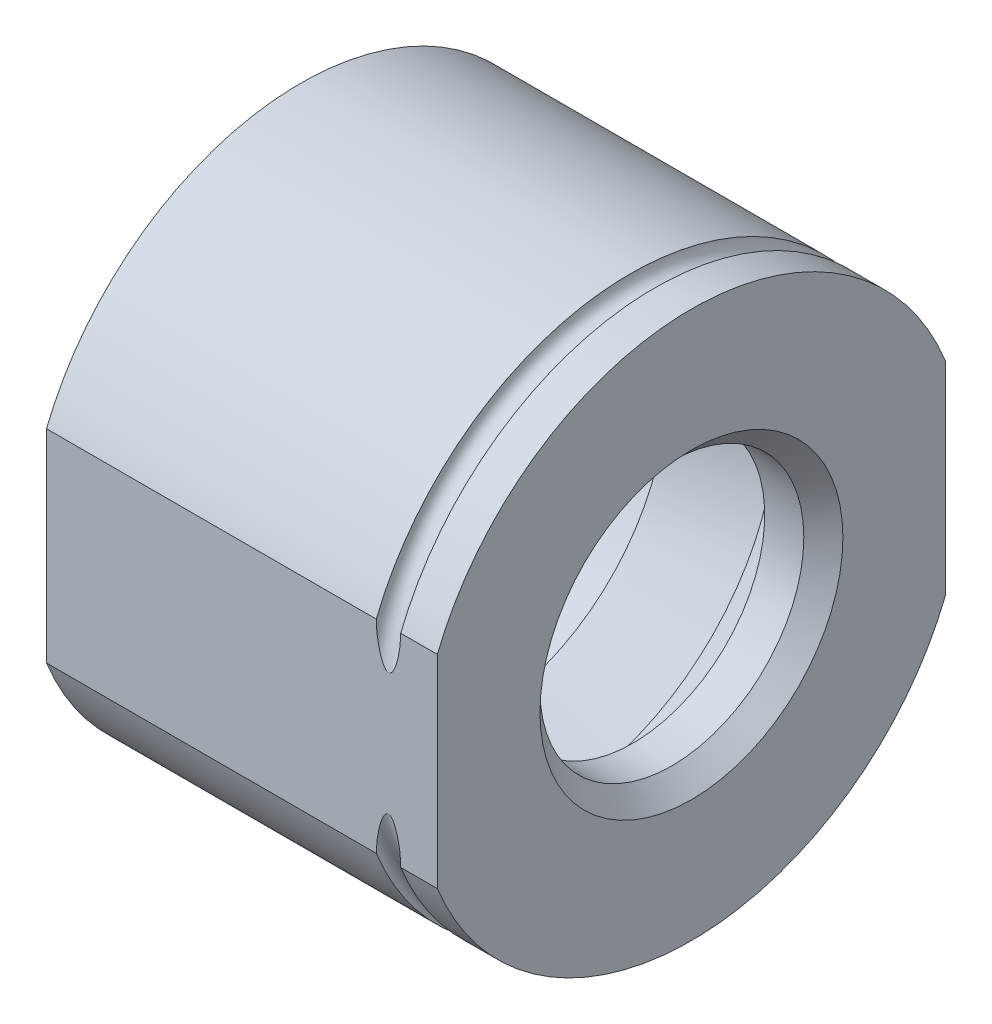
ISO-10303-21;
HEADER;
FILE_DESCRIPTION(('STEP AP214'),'2;1');
FILE_NAME('part.step','',(''),(''),'','','');
FILE_SCHEMA(('AUTOMOTIVE_DESIGN { 1 0 10303 214 1 1 1 1 }'));
ENDSEC;
DATA;
#1=APPLICATION_CONTEXT('core data for automotive mechanical design processes');
#2=APPLICATION_PROTOCOL_DEFINITION('international standard','automotive_design',2000,#1);
#3=PRODUCT_CONTEXT('',#1,'mechanical');
#4=PRODUCT('Part','Part','',(#3));
#5=PRODUCT_RELATED_PRODUCT_CATEGORY('part','',(#4));
#6=PRODUCT_DEFINITION_FORMATION('','',#4);
#7=PRODUCT_DEFINITION_CONTEXT('part definition',#1,'design');
#8=PRODUCT_DEFINITION('design','',#6,#7);
#9=PRODUCT_DEFINITION_SHAPE('','',#8);
#10=(LENGTH_UNIT() NAMED_UNIT(*) SI_UNIT(.MILLI.,.METRE.));
#11=(NAMED_UNIT(*) PLANE_ANGLE_UNIT() SI_UNIT($,.RADIAN.));
#12=(NAMED_UNIT(*) SI_UNIT($,.STERADIAN.) SOLID_ANGLE_UNIT());
#13=UNCERTAINTY_MEASURE_WITH_UNIT(LENGTH_MEASURE(1.E-05),#10,'distance_accuracy_value','');
#14=(GEOMETRIC_REPRESENTATION_CONTEXT(3) GLOBAL_UNCERTAINTY_ASSIGNED_CONTEXT((#13)) GLOBAL_UNIT_ASSIGNED_CONTEXT((#10,
#11,#12)) REPRESENTATION_CONTEXT('',''));
#15=CARTESIAN_POINT('',(0.,0.,0.));
#16=DIRECTION('',(0.,0.,1.));
#17=DIRECTION('',(1.,0.,0.));
#18=AXIS2_PLACEMENT_3D('',#15,#16,#17);
#19=CARTESIAN_POINT('',(-0.1016,0.,0.));
#20=DIRECTION('',(1.,0.,0.));
#21=DIRECTION('',(0.,0.,-1.));
#22=AXIS2_PLACEMENT_3D('',#19,#20,#21);
#23=CYLINDRICAL_SURFACE('',#22,1.42217319620361);
#24=DIRECTION('',(1.,0.,0.));
#25=VECTOR('',#24,1.);
#26=CARTESIAN_POINT('',(-0.1016,-0.527317703097479,-1.3208));
#27=LINE('',#26,#25);
#28=CARTESIAN_POINT('',(-0.1016,-0.527317703097479,-1.3208));
#29=VERTEX_POINT('',#28);
#30=CARTESIAN_POINT('',(1.6129,-0.527317703097479,-1.3208));
#31=VERTEX_POINT('',#30);
#32=EDGE_CURVE('E156',#29,#31,#27,.T.);
#33=ORIENTED_EDGE('',*,*,#32,.T.);
#34=CARTESIAN_POINT('',(1.6129,0.,0.));
#35=DIRECTION('',(-1.,0.,0.));
#36=DIRECTION('',(0.,0.,1.));
#37=AXIS2_PLACEMENT_3D('',#34,#35,#36);
#38=CIRCLE('',#37,1.42217319620361);
#39=CARTESIAN_POINT('',(1.6129,-0.527317703097479,1.3208));
#40=VERTEX_POINT('',#39);
#41=EDGE_CURVE('E77',#31,#40,#38,.T.);
#42=ORIENTED_EDGE('',*,*,#41,.T.);
#43=DIRECTION('',(1.,0.,0.));
#44=VECTOR('',#43,1.);
#45=CARTESIAN_POINT('',(-0.1016,-0.52731770309748,1.3208));
#46=LINE('',#45,#44);
#47=CARTESIAN_POINT('',(-0.1016,-0.52731770309748,1.3208));
#48=VERTEX_POINT('',#47);
#49=EDGE_CURVE('E148',#48,#40,#46,.T.);
#50=ORIENTED_EDGE('',*,*,#49,.F.);
#51=CARTESIAN_POINT('',(-0.1016,0.,0.));
#52=DIRECTION('',(1.,0.,0.));
#53=DIRECTION('',(0.,0.,-1.));
#54=AXIS2_PLACEMENT_3D('',#51,#52,#53);
#55=CIRCLE('',#54,1.42217319620361);
#56=EDGE_CURVE('E215',#48,#29,#55,.T.);
#57=ORIENTED_EDGE('',*,*,#56,.T.);
#58=EDGE_LOOP('',(#33,#42,#50,#57));
#59=FACE_BOUND('',#58,.T.);
#60=ADVANCED_FACE('F48',(#59),#23,.T.);
#61=CARTESIAN_POINT('',(1.7399,-0.527317703097479,1.3208));
#62=VERTEX_POINT('',#61);
#63=CARTESIAN_POINT('',(1.9304,-0.52731770309748,1.3208));
#64=VERTEX_POINT('',#63);
#65=EDGE_CURVE('E143',#62,#64,#46,.T.);
#66=ORIENTED_EDGE('',*,*,#65,.F.);
#67=CARTESIAN_POINT('',(1.7399,0.,0.));
#68=DIRECTION('',(-1.,0.,0.));
#69=DIRECTION('',(0.,0.,1.));
#70=AXIS2_PLACEMENT_3D('',#67,#68,#69);
#71=CIRCLE('',#70,1.42217319620361);
#72=CARTESIAN_POINT('',(1.7399,-0.527317703097479,-1.3208));
#73=VERTEX_POINT('',#72);
#74=EDGE_CURVE('E124',#73,#62,#71,.T.);
#75=ORIENTED_EDGE('',*,*,#74,.F.);
#76=CARTESIAN_POINT('',(1.9304,-0.527317703097479,-1.3208));
#77=VERTEX_POINT('',#76);
#78=EDGE_CURVE('E160',#73,#77,#27,.T.);
#79=ORIENTED_EDGE('',*,*,#78,.T.);
#80=CARTESIAN_POINT('',(1.9304,0.,0.));
#81=DIRECTION('',(1.,0.,0.));
#82=DIRECTION('',(0.,0.,-1.));
#83=AXIS2_PLACEMENT_3D('',#80,#81,#82);
#84=CIRCLE('',#83,1.42217319620361);
#85=EDGE_CURVE('E238',#64,#77,#84,.T.);
#86=ORIENTED_EDGE('',*,*,#85,.F.);
#87=EDGE_LOOP('',(#66,#75,#79,#86));
#88=FACE_BOUND('',#87,.T.);
#89=ADVANCED_FACE('F197',(#88),#23,.T.);
#90=CARTESIAN_POINT('',(-0.1016,0.527317703097479,1.3208));
#91=DIRECTION('',(0.,0.,1.));
#92=DIRECTION('',(1.,0.,0.));
#93=AXIS2_PLACEMENT_3D('',#90,#91,#92);
#94=PLANE('',#93);
#95=ORIENTED_EDGE('',*,*,#49,.T.);
#96=CARTESIAN_POINT('',(1.61327079992272,-0.508547522095153,1.3208));
#97=CARTESIAN_POINT('',(1.61410123201116,-0.487117532428304,1.3208));
#98=CARTESIAN_POINT('',(1.61627975921256,-0.465731752126961,1.3208));
#99=CARTESIAN_POINT('',(1.62138185103183,-0.43403056999215,1.3208));
#100=CARTESIAN_POINT('',(1.62338067178202,-0.423553308196953,1.3208));
#101=CARTESIAN_POINT('',(1.6280638385165,-0.40275481452524,1.3208));
#102=CARTESIAN_POINT('',(1.63074748955529,-0.392433435643484,1.3208));
#103=CARTESIAN_POINT('',(1.63546256570793,-0.377157917856461,1.3208));
#104=CARTESIAN_POINT('',(1.63715079474963,-0.372096594956818,1.3208));
#105=CARTESIAN_POINT('',(1.64084418063288,-0.362035815694534,1.3208));
#106=CARTESIAN_POINT('',(1.64285187204038,-0.357037231812776,1.3208));
#107=CARTESIAN_POINT('',(1.64733748589652,-0.347163535147122,1.3208));
#108=CARTESIAN_POINT('',(1.6498228688843,-0.342292000237766,1.3208));
#109=CARTESIAN_POINT('',(1.65551789037958,-0.332993263390576,1.3208));
#110=CARTESIAN_POINT('',(1.65871512718782,-0.328560135874237,1.3208));
#111=CARTESIAN_POINT('',(1.66355153874089,-0.324092145241062,1.3208));
#112=CARTESIAN_POINT('',(1.66447215226297,-0.323315443093113,1.3208));
#113=CARTESIAN_POINT('',(1.66640611453267,-0.321885735749664,1.3208));
#114=CARTESIAN_POINT('',(1.66741939369593,-0.321232638849707,1.3208));
#115=CARTESIAN_POINT('',(1.66933457313446,-0.320212696229645,1.3208));
#116=CARTESIAN_POINT('',(1.67021967432656,-0.319814866871306,1.3208));
#117=CARTESIAN_POINT('',(1.67204336047278,-0.319169284045743,1.3208));
#118=CARTESIAN_POINT('',(1.67298187194669,-0.318921329597116,1.3208));
#119=CARTESIAN_POINT('',(1.67489853209757,-0.31860428130753,1.3208));
#120=CARTESIAN_POINT('',(1.67587696392344,-0.318536837001317,1.3208));
#121=CARTESIAN_POINT('',(1.6778279065595,-0.318596097305675,1.3208));
#122=CARTESIAN_POINT('',(1.67880041661686,-0.318722826104412,1.3208));
#123=CARTESIAN_POINT('',(1.68058110971126,-0.319123573140062,1.3208));
#124=CARTESIAN_POINT('',(1.68139427801942,-0.31937642129739,1.3208));
#125=CARTESIAN_POINT('',(1.68297719383,-0.319992068501384,1.3208));
#126=CARTESIAN_POINT('',(1.6837469271034,-0.32035490333377,1.3208));
#127=CARTESIAN_POINT('',(1.68583739449962,-0.321492748366657,1.3208));
#128=CARTESIAN_POINT('',(1.68710485717128,-0.322364926868196,1.3208));
#129=CARTESIAN_POINT('',(1.68949839228136,-0.324285987804103,1.3208));
#130=CARTESIAN_POINT('',(1.69062389690994,-0.32533554287112,1.3208));
#131=CARTESIAN_POINT('',(1.69453607099004,-0.329374208686222,1.3208));
#132=CARTESIAN_POINT('',(1.69697751862376,-0.332689849075709,1.3208));
#133=CARTESIAN_POINT('',(1.70140708767815,-0.339609050012254,1.3208));
#134=CARTESIAN_POINT('',(1.70339208654412,-0.343214378586629,1.3208));
#135=CARTESIAN_POINT('',(1.70849759214814,-0.353443475618988,1.3208));
#136=CARTESIAN_POINT('',(1.71129602549062,-0.360228017415612,1.3208));
#137=CARTESIAN_POINT('',(1.71634479352295,-0.374001911644827,1.3208));
#138=CARTESIAN_POINT('',(1.71859370105788,-0.380991745647059,1.3208));
#139=CARTESIAN_POINT('',(1.72474020076049,-0.402145630129789,1.3208));
#140=CARTESIAN_POINT('',(1.72803340348204,-0.416484107399889,1.3208));
#141=CARTESIAN_POINT('',(1.73513153059778,-0.454348461118436,1.3208));
#142=CARTESIAN_POINT('',(1.73798650861486,-0.478055670215293,1.3208));
#143=CARTESIAN_POINT('',(1.73984052272239,-0.513721793580453,1.3208));
#144=CARTESIAN_POINT('',(1.74005388079704,-0.525626911185022,1.3208));
#145=CARTESIAN_POINT('',(1.7395168114693,-0.549412241893194,1.3208));
#146=CARTESIAN_POINT('',(1.73876746706724,-0.561292467948864,1.3208));
#147=CARTESIAN_POINT('',(1.73605017088207,-0.584950225018887,1.3208));
#148=CARTESIAN_POINT('',(1.73407846157779,-0.59672732539105,1.3208));
#149=CARTESIAN_POINT('',(1.72844424004516,-0.619887584482973,1.3208));
#150=CARTESIAN_POINT('',(1.72478991637334,-0.631272367255924,1.3208));
#151=CARTESIAN_POINT('',(1.71777383883732,-0.646241796367567,1.3208));
#152=CARTESIAN_POINT('',(1.71558154923911,-0.650365509435319,1.3208));
#153=CARTESIAN_POINT('',(1.71063667861031,-0.658260671854208,1.3208));
#154=CARTESIAN_POINT('',(1.70788637979442,-0.662033467580182,1.3208));
#155=CARTESIAN_POINT('',(1.70322222151157,-0.667209140761892,1.3208));
#156=CARTESIAN_POINT('',(1.701577896881,-0.668853646605565,1.3208));
#157=CARTESIAN_POINT('',(1.69808701509341,-0.671916081855663,1.3208));
#158=CARTESIAN_POINT('',(1.69624056819383,-0.673334133764535,1.3208));
#159=CARTESIAN_POINT('',(1.6926487891476,-0.675652533599948,1.3208));
#160=CARTESIAN_POINT('',(1.69093384795163,-0.67659931727464,1.3208));
#161=CARTESIAN_POINT('',(1.68737123338554,-0.67819930062222,1.3208));
#162=CARTESIAN_POINT('',(1.68552371641722,-0.678852839844647,1.3208));
#163=CARTESIAN_POINT('',(1.68171662867276,-0.679806399311097,1.3208));
#164=CARTESIAN_POINT('',(1.67975609549563,-0.680102687865833,1.3208));
#165=CARTESIAN_POINT('',(1.67581590524519,-0.680290279669111,1.3208));
#166=CARTESIAN_POINT('',(1.67383625938927,-0.680181807588212,1.3208));
#167=CARTESIAN_POINT('',(1.67024805390029,-0.679623931165019,1.3208));
#168=CARTESIAN_POINT('',(1.66863023861206,-0.679231037190397,1.3208));
#169=CARTESIAN_POINT('',(1.66547408176581,-0.678203392193641,1.3208));
#170=CARTESIAN_POINT('',(1.66393577656426,-0.677568531622616,1.3208));
#171=CARTESIAN_POINT('',(1.66025280634761,-0.675749674245639,1.3208));
#172=CARTESIAN_POINT('',(1.65816649669648,-0.67444803407407,1.3208));
#173=CARTESIAN_POINT('',(1.65422388166049,-0.671534214061854,1.3208));
#174=CARTESIAN_POINT('',(1.65236819178269,-0.669921231339192,1.3208));
#175=CARTESIAN_POINT('',(1.64768232182192,-0.665311077877855,1.3208));
#176=CARTESIAN_POINT('',(1.64504663381851,-0.662118019121602,1.3208));
#177=CARTESIAN_POINT('',(1.64026121906108,-0.655390452389046,1.3208));
#178=CARTESIAN_POINT('',(1.6381128481809,-0.651855029867408,1.3208));
#179=CARTESIAN_POINT('',(1.63218358567242,-0.640837936272729,1.3208));
#180=CARTESIAN_POINT('',(1.62899800247397,-0.633039490343991,1.3208));
#181=CARTESIAN_POINT('',(1.62368461339166,-0.617105700358118,1.3208));
#182=CARTESIAN_POINT('',(1.62155927700831,-0.608969617145235,1.3208));
#183=CARTESIAN_POINT('',(1.61663542783838,-0.585667721092861,1.3208));
#184=CARTESIAN_POINT('',(1.6147583774152,-0.570308703343404,1.3208));
#185=CARTESIAN_POINT('',(1.61277412663641,-0.539474773389508,1.3208));
#186=CARTESIAN_POINT('',(1.61267201535307,-0.52399965517009,1.3208));
#187=CARTESIAN_POINT('',(1.61327079992272,-0.508547522095153,1.3208));
#188=B_SPLINE_CURVE_WITH_KNOTS('',3,(#96,#97,#98,#99,#100,#101,#102,#103,#104,#105,#106,#107,
#108,#109,#110,#111,#112,#113,#114,#115,#116,#117,#118,#119,#120,#121,#122,#123,#124,#125,#126,
#127,#128,#129,#130,#131,#132,#133,#134,#135,#136,#137,#138,#139,#140,#141,#142,#143,#144,#145,
#146,#147,#148,#149,#150,#151,#152,#153,#154,#155,#156,#157,#158,#159,#160,#161,#162,#163,#164,
#165,#166,#167,#168,#169,#170,#171,#172,#173,#174,#175,#176,#177,#178,#179,#180,#181,#182,#183,
#184,#185,#186,#187),.UNSPECIFIED.,.T.,.F.,(4,2,2,2,2,2,2,2,2,2,2,2,2,2,2,2,2,2,2,2,2,2,2,2,2,2,
2,2,2,2,2,2,2,2,2,2,2,2,2,2,2,2,2,2,2,4),(0.,0.0643073680607315,0.0962943489159922,
0.128248998519312,0.144251576543813,0.160388104592895,0.176800834812584,0.192947342405822,
0.196553171577012,0.200156314955245,0.203056997418373,0.205953781402805,0.208876947765127,
0.211800478296221,0.214345885258932,0.216892121296326,0.221480731385624,0.226087149373269,
0.23834313845857,0.25068062907585,0.272641967714072,0.294659749257538,0.338727473877869,
0.410133303602389,0.445829402124988,0.481485379159332,0.517251509054085,0.552845390980571,
0.566828442449786,0.580755417192942,0.587717596303352,0.594675996303287,0.600531048279229,
0.606379303048142,0.612288131214861,0.618193680055287,0.623167172558658,0.628142919460163,
0.635478044167202,0.642832343504145,0.655183169500038,0.667567949113089,0.692698394737571,
0.717887103422975,0.764123501932235,0.810492446781076),.UNSPECIFIED.);
#189=EDGE_CURVE('E136',#40,#62,#188,.T.);
#190=ORIENTED_EDGE('',*,*,#189,.T.);
#191=ORIENTED_EDGE('',*,*,#65,.T.);
#192=DIRECTION('',(0.,-1.,0.));
#193=VECTOR('',#192,1.);
#194=CARTESIAN_POINT('',(1.9304,0.527317703097479,1.3208));
#195=LINE('',#194,#193);
#196=CARTESIAN_POINT('',(1.9304,0.527317703097479,1.3208));
#197=VERTEX_POINT('',#196);
#198=EDGE_CURVE('E232',#197,#64,#195,.T.);
#199=ORIENTED_EDGE('',*,*,#198,.F.);
#200=DIRECTION('',(1.,0.,0.));
#201=VECTOR('',#200,1.);
#202=CARTESIAN_POINT('',(-0.1016,0.527317703097479,1.3208));
#203=LINE('',#202,#201);
#204=CARTESIAN_POINT('',(1.7399,0.527317703097479,1.3208));
#205=VERTEX_POINT('',#204);
#206=EDGE_CURVE('E134',#205,#197,#203,.T.);
#207=ORIENTED_EDGE('',*,*,#206,.F.);
#208=CARTESIAN_POINT('',(1.67485270124336,0.318639997408028,1.3208));
#209=CARTESIAN_POINT('',(1.67386687935229,0.318742412070862,1.3208));
#210=CARTESIAN_POINT('',(1.67289151287556,0.318942869633638,1.3208));
#211=CARTESIAN_POINT('',(1.6709909606494,0.319511944215622,1.3208));
#212=CARTESIAN_POINT('',(1.67006588305181,0.319880908769566,1.3208));
#213=CARTESIAN_POINT('',(1.6679035724575,0.320931599129008,1.3208));
#214=CARTESIAN_POINT('',(1.66669910547798,0.321679602685286,1.3208));
#215=CARTESIAN_POINT('',(1.66441676867692,0.323347044128238,1.3208));
#216=CARTESIAN_POINT('',(1.66333922271222,0.324266905718393,1.3208));
#217=CARTESIAN_POINT('',(1.65976205630876,0.32766536088741,1.3208));
#218=CARTESIAN_POINT('',(1.65753516851105,0.330424700878596,1.3208));
#219=CARTESIAN_POINT('',(1.65347270508397,0.336217653500864,1.3208));
#220=CARTESIAN_POINT('',(1.65163986768691,0.339252989168973,1.3208));
#221=CARTESIAN_POINT('',(1.64700788868944,0.347708258443656,1.3208));
#222=CARTESIAN_POINT('',(1.64446576005205,0.353268484780056,1.3208));
#223=CARTESIAN_POINT('',(1.63984056234651,0.364579721034463,1.3208));
#224=CARTESIAN_POINT('',(1.63775868854174,0.370331184091349,1.3208));
#225=CARTESIAN_POINT('',(1.63200180210707,0.387759239285524,1.3208));
#226=CARTESIAN_POINT('',(1.62882028640237,0.399599160587468,1.3208));
#227=CARTESIAN_POINT('',(1.62337439221561,0.423408202017514,1.3208));
#228=CARTESIAN_POINT('',(1.6211051949246,0.435376291119901,1.3208));
#229=CARTESIAN_POINT('',(1.61736768752501,0.459452231922754,1.3208));
#230=CARTESIAN_POINT('',(1.61590027771416,0.471560225208688,1.3208));
#231=CARTESIAN_POINT('',(1.61378576345627,0.495846706802483,1.3208));
#232=CARTESIAN_POINT('',(1.61313859737155,0.508025189744261,1.3208));
#233=CARTESIAN_POINT('',(1.61276954310186,0.532395607084063,1.3208));
#234=CARTESIAN_POINT('',(1.61304713822346,0.544587530166974,1.3208));
#235=CARTESIAN_POINT('',(1.61485487416913,0.570648211961541,1.3208));
#236=CARTESIAN_POINT('',(1.61656016285556,0.584504779766506,1.3208));
#237=CARTESIAN_POINT('',(1.62201897244385,0.611814654817939,1.3208));
#238=CARTESIAN_POINT('',(1.62575875685203,0.625270035234794,1.3208));
#239=CARTESIAN_POINT('',(1.63311094710097,0.642331980961519,1.3208));
#240=CARTESIAN_POINT('',(1.63518503453793,0.646588546940789,1.3208));
#241=CARTESIAN_POINT('',(1.63986818218345,0.654797709817243,1.3208));
#242=CARTESIAN_POINT('',(1.64247577349738,0.658751101208217,1.3208));
#243=CARTESIAN_POINT('',(1.64704690388863,0.6644455139038,1.3208));
#244=CARTESIAN_POINT('',(1.64876911710487,0.666379074235364,1.3208));
#245=CARTESIAN_POINT('',(1.65245364028426,0.67000652980535,1.3208));
#246=CARTESIAN_POINT('',(1.65441576698252,0.671700605874049,1.3208));
#247=CARTESIAN_POINT('',(1.6581541374291,0.674416076951593,1.3208));
#248=CARTESIAN_POINT('',(1.6598815407574,0.675503937414628,1.3208));
#249=CARTESIAN_POINT('',(1.66348905051617,0.677388437120524,1.3208));
#250=CARTESIAN_POINT('',(1.66536888772262,0.678185576698707,1.3208));
#251=CARTESIAN_POINT('',(1.66891061067837,0.679306623474783,1.3208));
#252=CARTESIAN_POINT('',(1.67055396687525,0.679688530183748,1.3208));
#253=CARTESIAN_POINT('',(1.67388169024811,0.68016817357055,1.3208));
#254=CARTESIAN_POINT('',(1.67556603050335,0.680266091964701,1.3208));
#255=CARTESIAN_POINT('',(1.67892664750177,0.680168318935855,1.3208));
#256=CARTESIAN_POINT('',(1.68060292078759,0.679972511225546,1.3208));
#257=CARTESIAN_POINT('',(1.68389973751802,0.679306007919346,1.3208));
#258=CARTESIAN_POINT('',(1.68552023645758,0.678835097955042,1.3208));
#259=CARTESIAN_POINT('',(1.68913419244172,0.677483140695746,1.3208));
#260=CARTESIAN_POINT('',(1.69109759177292,0.676522300117137,1.3208));
#261=CARTESIAN_POINT('',(1.69484426913914,0.674298516253261,1.3208));
#262=CARTESIAN_POINT('',(1.69662717239449,0.673034962006437,1.3208));
#263=CARTESIAN_POINT('',(1.70098712123166,0.669497818975332,1.3208));
#264=CARTESIAN_POINT('',(1.70343086447325,0.667061385910786,1.3208));
#265=CARTESIAN_POINT('',(1.70793170846882,0.661856923542702,1.3208));
#266=CARTESIAN_POINT('',(1.70998773326133,0.659088005377836,1.3208));
#267=CARTESIAN_POINT('',(1.7155406576783,0.650683494144398,1.3208));
#268=CARTESIAN_POINT('',(1.71860883735985,0.644767620085065,1.3208));
#269=CARTESIAN_POINT('',(1.7239154669005,0.632588373320861,1.3208));
#270=CARTESIAN_POINT('',(1.72615221175215,0.626324316495643,1.3208));
#271=CARTESIAN_POINT('',(1.73235119315264,0.605922326338034,1.3208));
#272=CARTESIAN_POINT('',(1.73512621212539,0.591428690876174,1.3208));
#273=CARTESIAN_POINT('',(1.73880530862914,0.562169813958327,1.3208));
#274=CARTESIAN_POINT('',(1.73969710334,0.547403419225165,1.3208));
#275=CARTESIAN_POINT('',(1.74004019012186,0.517947737283945,1.3208));
#276=CARTESIAN_POINT('',(1.7395003636086,0.503258538487747,1.3208));
#277=CARTESIAN_POINT('',(1.73722348673311,0.473972425036437,1.3208));
#278=CARTESIAN_POINT('',(1.73548610614998,0.459375536956306,1.3208));
#279=CARTESIAN_POINT('',(1.73085795576051,0.430483409135114,1.3208));
#280=CARTESIAN_POINT('',(1.72797594151972,0.416186727586896,1.3208));
#281=CARTESIAN_POINT('',(1.7208916075669,0.38793826477456,1.3208));
#282=CARTESIAN_POINT('',(1.71669406773519,0.37398542906251,1.3208));
#283=CARTESIAN_POINT('',(1.71016635336418,0.357711152939245,1.3208));
#284=CARTESIAN_POINT('',(1.70899430032861,0.354938760191774,1.3208));
#285=CARTESIAN_POINT('',(1.70650600989737,0.349459448066692,1.3208));
#286=CARTESIAN_POINT('',(1.70518952407086,0.346752651595668,1.3208));
#287=CARTESIAN_POINT('',(1.70080069063145,0.338394182886188,1.3208));
#288=CARTESIAN_POINT('',(1.69742000331662,0.332857472000263,1.3208));
#289=CARTESIAN_POINT('',(1.69231820163847,0.327076676955551,1.3208));
#290=CARTESIAN_POINT('',(1.69141952774781,0.326129138198481,1.3208));
#291=CARTESIAN_POINT('',(1.68952731085036,0.324328750697798,1.3208));
#292=CARTESIAN_POINT('',(1.68853360723617,0.323476067721503,1.3208));
#293=CARTESIAN_POINT('',(1.68642302544908,0.321899535857425,1.3208));
#294=CARTESIAN_POINT('',(1.68530454366573,0.321177777673098,1.3208));
#295=CARTESIAN_POINT('',(1.68295252344134,0.319956273786091,1.3208));
#296=CARTESIAN_POINT('',(1.68171951920497,0.319455554327663,1.3208));
#297=CARTESIAN_POINT('',(1.67953604706088,0.318862173137515,1.3208));
#298=CARTESIAN_POINT('',(1.67860652234646,0.318693510335914,1.3208));
#299=CARTESIAN_POINT('',(1.67673242080308,0.318533919329986,1.3208));
#300=CARTESIAN_POINT('',(1.67578785686291,0.31854284634216,1.3208));
#301=CARTESIAN_POINT('',(1.67485270124336,0.318639997408028,1.3208));
#302=B_SPLINE_CURVE_WITH_KNOTS('',3,(#208,#209,#210,#211,#212,#213,#214,#215,#216,#217,#218,
#219,#220,#221,#222,#223,#224,#225,#226,#227,#228,#229,#230,#231,#232,#233,#234,#235,#236,#237,
#238,#239,#240,#241,#242,#243,#244,#245,#246,#247,#248,#249,#250,#251,#252,#253,#254,#255,#256,
#257,#258,#259,#260,#261,#262,#263,#264,#265,#266,#267,#268,#269,#270,#271,#272,#273,#274,#275,
#276,#277,#278,#279,#280,#281,#282,#283,#284,#285,#286,#287,#288,#289,#290,#291,#292,#293,#294,
#295,#296,#297,#298,#299,#300,#301),.UNSPECIFIED.,.T.,.F.,(4,2,2,2,2,2,2,2,2,2,2,2,2,2,2,2,2,2,
2,2,2,2,2,2,2,2,2,2,2,2,2,2,2,2,2,2,2,2,2,2,2,2,2,2,2,2,4),(0.,0.00296910834186236,
0.0059443681251479,0.0101736245207005,0.0144134488285887,0.0249691033128915,0.0355958935418746,
0.0538905174271889,0.0722321077251544,0.108949214530345,0.145469752273428,0.182031213754402,
0.218589927640682,0.255128218439543,0.296944773291562,0.33848243356271,0.35266283998346,
0.366804716616884,0.374556973965302,0.382303346094276,0.388406746755628,0.394499593237477,
0.399538750624888,0.404574682881903,0.409612609410458,0.414654466897612,0.421175477156502,
0.427709761205372,0.438003659392266,0.448325716911143,0.468205904282348,0.488126637559675,
0.532152778338705,0.576465191910785,0.620503346532936,0.664553649366529,0.708273297856483,
0.75183590021912,0.760859512587428,0.76989889679905,0.789113784323038,0.793026381943539,
0.796945713118461,0.800922978837073,0.804882544010865,0.807701353157664,0.81051786431053),.UNSPECIFIED.);
#303=CARTESIAN_POINT('',(1.6129,0.527317703097479,1.3208));
#304=VERTEX_POINT('',#303);
#305=EDGE_CURVE('E119',#205,#304,#302,.T.);
#306=ORIENTED_EDGE('',*,*,#305,.T.);
#307=CARTESIAN_POINT('',(-0.1016,0.527317703097479,1.3208));
#308=VERTEX_POINT('',#307);
#309=EDGE_CURVE('E131',#308,#304,#203,.T.);
#310=ORIENTED_EDGE('',*,*,#309,.F.);
#311=DIRECTION('',(0.,-1.,0.));
#312=VECTOR('',#311,1.);
#313=CARTESIAN_POINT('',(-0.1016,0.527317703097479,1.3208));
#314=LINE('',#313,#312);
#315=EDGE_CURVE('E229',#308,#48,#314,.T.);
#316=ORIENTED_EDGE('',*,*,#315,.T.);
#317=EDGE_LOOP('',(#95,#190,#191,#199,#207,#306,#310,#316));
#318=FACE_BOUND('',#317,.T.);
#319=ADVANCED_FACE('F129',(#318),#94,.T.);
#320=CARTESIAN_POINT('',(-0.1016,0.,0.));
#321=DIRECTION('',(1.,0.,0.));
#322=DIRECTION('',(0.,0.,-1.));
#323=AXIS2_PLACEMENT_3D('',#320,#321,#322);
#324=CYLINDRICAL_SURFACE('',#323,1.42217319620361);
#325=ORIENTED_EDGE('',*,*,#309,.T.);
#326=CARTESIAN_POINT('',(1.6129,0.527317703097479,-1.3208));
#327=VERTEX_POINT('',#326);
#328=EDGE_CURVE('E116',#304,#327,#38,.T.);
#329=ORIENTED_EDGE('',*,*,#328,.T.);
#330=DIRECTION('',(1.,0.,0.));
#331=VECTOR('',#330,1.);
#332=CARTESIAN_POINT('',(-0.1016,0.52731770309748,-1.3208));
#333=LINE('',#332,#331);
#334=CARTESIAN_POINT('',(-0.1016,0.52731770309748,-1.3208));
#335=VERTEX_POINT('',#334);
#336=EDGE_CURVE('E150',#335,#327,#333,.T.);
#337=ORIENTED_EDGE('',*,*,#336,.F.);
#338=CARTESIAN_POINT('',(-0.1016,0.,0.));
#339=DIRECTION('',(1.,0.,0.));
#340=DIRECTION('',(0.,0.,-1.));
#341=AXIS2_PLACEMENT_3D('',#338,#339,#340);
#342=CIRCLE('',#341,1.42217319620361);
#343=EDGE_CURVE('E140',#335,#308,#342,.T.);
#344=ORIENTED_EDGE('',*,*,#343,.T.);
#345=EDGE_LOOP('',(#325,#329,#337,#344));
#346=FACE_BOUND('',#345,.T.);
#347=ADVANCED_FACE('F138',(#346),#324,.T.);
#348=CARTESIAN_POINT('',(1.7399,0.52731770309748,-1.3208));
#349=VERTEX_POINT('',#348);
#350=CARTESIAN_POINT('',(1.9304,0.52731770309748,-1.3208));
#351=VERTEX_POINT('',#350);
#352=EDGE_CURVE('E155',#349,#351,#333,.T.);
#353=ORIENTED_EDGE('',*,*,#352,.F.);
#354=EDGE_CURVE('E69',#205,#349,#71,.T.);
#355=ORIENTED_EDGE('',*,*,#354,.F.);
#356=ORIENTED_EDGE('',*,*,#206,.T.);
#357=CARTESIAN_POINT('',(1.9304,0.,0.));
#358=DIRECTION('',(1.,0.,0.));
#359=DIRECTION('',(0.,0.,-1.));
#360=AXIS2_PLACEMENT_3D('',#357,#358,#359);
#361=CIRCLE('',#360,1.42217319620361);
#362=EDGE_CURVE('E247',#351,#197,#361,.T.);
#363=ORIENTED_EDGE('',*,*,#362,.F.);
#364=EDGE_LOOP('',(#353,#355,#356,#363));
#365=FACE_BOUND('',#364,.T.);
#366=ADVANCED_FACE('F202',(#365),#324,.T.);
#367=CARTESIAN_POINT('',(-0.1016,-0.527317703097479,-1.3208));
#368=DIRECTION('',(0.,0.,-1.));
#369=DIRECTION('',(-1.,0.,0.));
#370=AXIS2_PLACEMENT_3D('',#367,#368,#369);
#371=PLANE('',#370);
#372=ORIENTED_EDGE('',*,*,#78,.F.);
#373=CARTESIAN_POINT('',(1.61327079992272,-0.508547522095152,-1.3208));
#374=CARTESIAN_POINT('',(1.61261675839651,-0.525415150751983,-1.3208));
#375=CARTESIAN_POINT('',(1.61279822570286,-0.542310168696948,-1.3208));
#376=CARTESIAN_POINT('',(1.61533279389331,-0.57600415215576,-1.3208));
#377=CARTESIAN_POINT('',(1.6176855526725,-0.592803132381609,-1.3208));
#378=CARTESIAN_POINT('',(1.62380091420713,-0.61742472619507,-1.3208));
#379=CARTESIAN_POINT('',(1.62628316317367,-0.62556216477486,-1.3208));
#380=CARTESIAN_POINT('',(1.63247664988756,-0.641362607602067,-1.3208));
#381=CARTESIAN_POINT('',(1.63618054255279,-0.649028130045487,-1.3208));
#382=CARTESIAN_POINT('',(1.64275183345288,-0.659005414192534,-1.3208));
#383=CARTESIAN_POINT('',(1.64483893368214,-0.66182363839497,-1.3208));
#384=CARTESIAN_POINT('',(1.64941445650297,-0.667113124486188,-1.3208));
#385=CARTESIAN_POINT('',(1.6519014298823,-0.669585581172132,-1.3208));
#386=CARTESIAN_POINT('',(1.65619095129826,-0.673039834902514,-1.3208));
#387=CARTESIAN_POINT('',(1.65784024417646,-0.674210725154705,-1.3208));
#388=CARTESIAN_POINT('',(1.66129570582234,-0.676297390403908,-1.3208));
#389=CARTESIAN_POINT('',(1.6631018161375,-0.677213259927004,-1.3208));
#390=CARTESIAN_POINT('',(1.66687391620868,-0.678723598499577,-1.3208));
#391=CARTESIAN_POINT('',(1.66884164177121,-0.679313848179492,-1.3208));
#392=CARTESIAN_POINT('',(1.67285537887436,-0.680082822674359,-1.3208));
#393=CARTESIAN_POINT('',(1.67490124875669,-0.680262259269559,-1.3208));
#394=CARTESIAN_POINT('',(1.67867023877508,-0.680192471923984,-1.3208));
#395=CARTESIAN_POINT('',(1.68039477795226,-0.680004718614173,-1.3208));
#396=CARTESIAN_POINT('',(1.68378656912692,-0.679337886354141,-1.3208));
#397=CARTESIAN_POINT('',(1.68545377862022,-0.678858595977387,-1.3208));
#398=CARTESIAN_POINT('',(1.68911066849086,-0.677493634492949,-1.3208));
#399=CARTESIAN_POINT('',(1.69107288716969,-0.676535114722883,-1.3208));
#400=CARTESIAN_POINT('',(1.69481745730647,-0.674316263426883,-1.3208));
#401=CARTESIAN_POINT('',(1.69659945978365,-0.673055361680976,-1.3208));
#402=CARTESIAN_POINT('',(1.70095678358107,-0.66952567836429,-1.3208));
#403=CARTESIAN_POINT('',(1.70339913644134,-0.667094234716396,-1.3208));
#404=CARTESIAN_POINT('',(1.70789786741665,-0.661899839455997,-1.3208));
#405=CARTESIAN_POINT('',(1.70995317339191,-0.659136000767843,-1.3208));
#406=CARTESIAN_POINT('',(1.7155024952739,-0.650749537431913,-1.3208));
#407=CARTESIAN_POINT('',(1.71856906328822,-0.644847043306452,-1.3208));
#408=CARTESIAN_POINT('',(1.72387507500211,-0.632692603463453,-1.3208));
#409=CARTESIAN_POINT('',(1.72611254465239,-0.626439864021009,-1.3208));
#410=CARTESIAN_POINT('',(1.73231816215948,-0.606064450352967,-1.3208));
#411=CARTESIAN_POINT('',(1.73509881841223,-0.591585095724777,-1.3208));
#412=CARTESIAN_POINT('',(1.73878582752574,-0.562384449858067,-1.3208));
#413=CARTESIAN_POINT('',(1.73968379974247,-0.547662369627248,-1.3208));
#414=CARTESIAN_POINT('',(1.74004566923088,-0.518334734819648,-1.3208));
#415=CARTESIAN_POINT('',(1.73952244034649,-0.50372932819075,-1.3208));
#416=CARTESIAN_POINT('',(1.73728732279893,-0.474613681863551,-1.3208));
#417=CARTESIAN_POINT('',(1.73557516444021,-0.460103464511899,-1.3208));
#418=CARTESIAN_POINT('',(1.73099951949949,-0.431203605143025,-1.3208));
#419=CARTESIAN_POINT('',(1.72813190673275,-0.416814585959437,-1.3208));
#420=CARTESIAN_POINT('',(1.72279392929205,-0.395519464923004,-1.3208));
#421=CARTESIAN_POINT('',(1.72084581143536,-0.388480267521818,-1.3208));
#422=CARTESIAN_POINT('',(1.71651368849237,-0.374538097732196,-1.3208));
#423=CARTESIAN_POINT('',(1.71413025334996,-0.367634960147981,-1.3208));
#424=CARTESIAN_POINT('',(1.70908757404103,-0.354988471325973,-1.3208));
#425=CARTESIAN_POINT('',(1.7065065674049,-0.349212530076248,-1.3208));
#426=CARTESIAN_POINT('',(1.70060710677091,-0.338082071064138,-1.3208));
#427=CARTESIAN_POINT('',(1.69730099595418,-0.332722322972923,-1.3208));
#428=CARTESIAN_POINT('',(1.69230264360473,-0.327059108472001,-1.3208));
#429=CARTESIAN_POINT('',(1.69138800762071,-0.326096027259112,-1.3208));
#430=CARTESIAN_POINT('',(1.68945946536391,-0.324267573313267,-1.3208));
#431=CARTESIAN_POINT('',(1.68844529718644,-0.323402472006079,-1.3208));
#432=CARTESIAN_POINT('',(1.68628803969841,-0.321807276387492,-1.3208));
#433=CARTESIAN_POINT('',(1.68514317503171,-0.321079517057925,-1.3208));
#434=CARTESIAN_POINT('',(1.68273466226995,-0.319859801727911,-1.3208));
#435=CARTESIAN_POINT('',(1.68147166290634,-0.319366639053292,-1.3208));
#436=CARTESIAN_POINT('',(1.67933272320696,-0.318824946354552,-1.3208));
#437=CARTESIAN_POINT('',(1.67848117838574,-0.318680253541753,-1.3208));
#438=CARTESIAN_POINT('',(1.67676580426602,-0.31853947675197,-1.3208));
#439=CARTESIAN_POINT('',(1.67590198204174,-0.318543310408679,-1.3208));
#440=CARTESIAN_POINT('',(1.67418971355092,-0.318699042234939,-1.3208));
#441=CARTESIAN_POINT('',(1.67334124344834,-0.318850686379354,-1.3208));
#442=CARTESIAN_POINT('',(1.67167864810388,-0.319285081459442,-1.3208));
#443=CARTESIAN_POINT('',(1.6708645614071,-0.319567975486696,-1.3208));
#444=CARTESIAN_POINT('',(1.66888185938026,-0.320411215344878,-1.3208));
#445=CARTESIAN_POINT('',(1.66774241979139,-0.321039518231935,-1.3208));
#446=CARTESIAN_POINT('',(1.66557300386122,-0.322462319607805,-1.3208));
#447=CARTESIAN_POINT('',(1.66454335724768,-0.323257298562128,-1.3208));
#448=CARTESIAN_POINT('',(1.66166659781267,-0.325747275621808,-1.3208));
#449=CARTESIAN_POINT('',(1.65995050602971,-0.327591332865354,-1.3208));
#450=CARTESIAN_POINT('',(1.65677311983919,-0.331484873419872,-1.3208));
#451=CARTESIAN_POINT('',(1.65531271967591,-0.333535039719164,-1.3208));
#452=CARTESIAN_POINT('',(1.64914765295724,-0.342967479110732,-1.3208));
#453=CARTESIAN_POINT('',(1.64539154791257,-0.350949159750343,-1.3208));
#454=CARTESIAN_POINT('',(1.63876733396432,-0.367259863421521,-1.3208));
#455=CARTESIAN_POINT('',(1.6359048606686,-0.375590729343609,-1.3208));
#456=CARTESIAN_POINT('',(1.63029348169723,-0.394103647322996,-1.3208));
#457=CARTESIAN_POINT('',(1.6276773540404,-0.404327858124693,-1.3208));
#458=CARTESIAN_POINT('',(1.62310830333054,-0.424924959947907,-1.3208));
#459=CARTESIAN_POINT('',(1.62115616324959,-0.43529801157053,-1.3208));
#460=CARTESIAN_POINT('',(1.61620210504112,-0.466513296283818,-1.3208));
#461=CARTESIAN_POINT('',(1.61408656358623,-0.487509104813605,-1.3208));
#462=CARTESIAN_POINT('',(1.61327079992272,-0.508547522095152,-1.3208));
#463=B_SPLINE_CURVE_WITH_KNOTS('',3,(#373,#374,#375,#376,#377,#378,#379,#380,#381,#382,#383,
#384,#385,#386,#387,#388,#389,#390,#391,#392,#393,#394,#395,#396,#397,#398,#399,#400,#401,#402,
#403,#404,#405,#406,#407,#408,#409,#410,#411,#412,#413,#414,#415,#416,#417,#418,#419,#420,#421,
#422,#423,#424,#425,#426,#427,#428,#429,#430,#431,#432,#433,#434,#435,#436,#437,#438,#439,#440,
#441,#442,#443,#444,#445,#446,#447,#448,#449,#450,#451,#452,#453,#454,#455,#456,#457,#458,#459,
#460,#461,#462),.UNSPECIFIED.,.T.,.F.,(4,2,2,2,2,2,2,2,2,2,2,2,2,2,2,2,2,2,2,2,2,2,2,2,2,2,2,2,
2,2,2,2,2,2,2,2,2,2,2,2,2,2,2,2,4),(0.,0.0506172059802219,0.101226438162386,0.126703020855219,
0.152029136998985,0.162524402412534,0.172982454648954,0.179033184832697,0.185081669255788,
0.19120679152256,0.197321293263081,0.202498869140472,0.2076802043485,0.21419526493456,
0.220722709333759,0.231003185962656,0.241311734114513,0.261154308355138,0.281043827925715,
0.325030588405114,0.369212740905936,0.41299601056582,0.456789215223448,0.500740213553926,
0.522645253795957,0.544521817577181,0.563503387051158,0.582183954228778,0.586162820724435,
0.590152453047862,0.594204775074121,0.598236021910294,0.600815618269995,0.603393784118471,
0.605967526963568,0.608544082378617,0.612425097655295,0.616317458188984,0.623832277100788,
0.631372874650458,0.657637313779756,0.684064189045196,0.715682567735957,0.747338102498471,
0.810471215202293),.UNSPECIFIED.);
#464=EDGE_CURVE('E11',#73,#31,#463,.T.);
#465=ORIENTED_EDGE('',*,*,#464,.T.);
#466=ORIENTED_EDGE('',*,*,#32,.F.);
#467=DIRECTION('',(0.,1.,0.));
#468=VECTOR('',#467,1.);
#469=CARTESIAN_POINT('',(-0.1016,-0.527317703097479,-1.3208));
#470=LINE('',#469,#468);
#471=EDGE_CURVE('E220',#29,#335,#470,.T.);
#472=ORIENTED_EDGE('',*,*,#471,.T.);
#473=ORIENTED_EDGE('',*,*,#336,.T.);
#474=CARTESIAN_POINT('',(1.6764,0.318559592670102,-1.3208));
#475=CARTESIAN_POINT('',(1.67746282282419,0.318559898164679,-1.3208));
#476=CARTESIAN_POINT('',(1.67852717484704,0.318675499118343,-1.3208));
#477=CARTESIAN_POINT('',(1.68061158329735,0.319118449807695,-1.3208));
#478=CARTESIAN_POINT('',(1.68163148217041,0.319446496184389,-1.3208));
#479=CARTESIAN_POINT('',(1.68383367348967,0.320366559166432,-1.3208));
#480=CARTESIAN_POINT('',(1.68499705442182,0.321002748471865,-1.3208));
#481=CARTESIAN_POINT('',(1.68720932583006,0.322447896992667,-1.3208));
#482=CARTESIAN_POINT('',(1.68825796824675,0.32325721977894,-1.3208));
#483=CARTESIAN_POINT('',(1.69115224123134,0.325765979759885,-1.3208));
#484=CARTESIAN_POINT('',(1.69286836733073,0.327612321330147,-1.3208));
#485=CARTESIAN_POINT('',(1.6960455933164,0.331509911545597,-1.3208));
#486=CARTESIAN_POINT('',(1.69750585047296,0.333561803568967,-1.3208));
#487=CARTESIAN_POINT('',(1.70367490150245,0.343008249902559,-1.3208));
#488=CARTESIAN_POINT('',(1.70743392502109,0.351002408371645,-1.3208));
#489=CARTESIAN_POINT('',(1.71406451532974,0.367347094354705,-1.3208));
#490=CARTESIAN_POINT('',(1.71692953410766,0.375699763931804,-1.3208));
#491=CARTESIAN_POINT('',(1.72353086088359,0.397490792350752,-1.3208));
#492=CARTESIAN_POINT('',(1.72681075524,0.411072823552474,-1.3208));
#493=CARTESIAN_POINT('',(1.73228408484013,0.438465738579043,-1.3208));
#494=CARTESIAN_POINT('',(1.73447523322759,0.452277041664371,-1.3208));
#495=CARTESIAN_POINT('',(1.73779943978351,0.479985447982938,-1.3208));
#496=CARTESIAN_POINT('',(1.73893583518397,0.493882139593466,-1.3208));
#497=CARTESIAN_POINT('',(1.74006325935305,0.521720860536844,-1.3208));
#498=CARTESIAN_POINT('',(1.74005491072215,0.53566286110098,-1.3208));
#499=CARTESIAN_POINT('',(1.73864866299022,0.563093385773187,-1.3208));
#500=CARTESIAN_POINT('',(1.73728902588302,0.576583827130001,-1.3208));
#501=CARTESIAN_POINT('',(1.73276670764172,0.603316827976804,-1.3208));
#502=CARTESIAN_POINT('',(1.72960514078063,0.616559535437883,-1.3208));
#503=CARTESIAN_POINT('',(1.72266505432828,0.635714178167182,-1.3208));
#504=CARTESIAN_POINT('',(1.71996562455298,0.642011538755337,-1.3208));
#505=CARTESIAN_POINT('',(1.71352528798574,0.654048301707908,-1.3208));
#506=CARTESIAN_POINT('',(1.70979316226215,0.659791880767819,-1.3208));
#507=CARTESIAN_POINT('',(1.7035192547795,0.666919292968381,-1.3208));
#508=CARTESIAN_POINT('',(1.70160795160923,0.668850422477783,-1.3208));
#509=CARTESIAN_POINT('',(1.69750980143018,0.672395989505301,-1.3208));
#510=CARTESIAN_POINT('',(1.69532364765341,0.674011198525089,-1.3208));
#511=CARTESIAN_POINT('',(1.69141151809986,0.676337842863266,-1.3208));
#512=CARTESIAN_POINT('',(1.68975991242957,0.677173390195303,-1.3208));
#513=CARTESIAN_POINT('',(1.68634336120977,0.678569740218007,-1.3208));
#514=CARTESIAN_POINT('',(1.68457852038871,0.679130792754453,-1.3208));
#515=CARTESIAN_POINT('',(1.68095996013051,0.679928855181258,-1.3208));
#516=CARTESIAN_POINT('',(1.67910562977794,0.680163165865573,-1.3208));
#517=CARTESIAN_POINT('',(1.67538661905793,0.680271257673377,-1.3208));
#518=CARTESIAN_POINT('',(1.67352194234119,0.680145158781651,-1.3208));
#519=CARTESIAN_POINT('',(1.67005369906187,0.679581446413938,-1.3208));
#520=CARTESIAN_POINT('',(1.66844404657174,0.679179791796388,-1.3208));
#521=CARTESIAN_POINT('',(1.66530471926509,0.678137727842494,-1.3208));
#522=CARTESIAN_POINT('',(1.66377508619942,0.677497195258649,-1.3208));
#523=CARTESIAN_POINT('',(1.66009257576778,0.67565751751504,-1.3208));
#524=CARTESIAN_POINT('',(1.65799990724639,0.674338314468909,-1.3208));
#525=CARTESIAN_POINT('',(1.65404710106793,0.671388867371109,-1.3208));
#526=CARTESIAN_POINT('',(1.65218759699662,0.669757804976597,-1.3208));
#527=CARTESIAN_POINT('',(1.64748551186444,0.665091189279619,-1.3208));
#528=CARTESIAN_POINT('',(1.6448406943309,0.661858176751622,-1.3208));
#529=CARTESIAN_POINT('',(1.64004220318495,0.655050233151398,-1.3208));
#530=CARTESIAN_POINT('',(1.63788990557612,0.651474382820064,-1.3208));
#531=CARTESIAN_POINT('',(1.63194429680775,0.640317583277945,-1.3208));
#532=CARTESIAN_POINT('',(1.62875512301238,0.632418266588115,-1.3208));
#533=CARTESIAN_POINT('',(1.62344936534525,0.616285001958742,-1.3208));
#534=CARTESIAN_POINT('',(1.62133503946618,0.60805038849247,-1.3208));
#535=CARTESIAN_POINT('',(1.61573703364884,0.581059826872358,-1.3208));
#536=CARTESIAN_POINT('',(1.61383036037018,0.561980452370429,-1.3208));
#537=CARTESIAN_POINT('',(1.61250562003447,0.523695744658882,-1.3208));
#538=CARTESIAN_POINT('',(1.61310318479804,0.504490369654553,-1.3208));
#539=CARTESIAN_POINT('',(1.61656286180668,0.463077473160361,-1.3208));
#540=CARTESIAN_POINT('',(1.61978158523499,0.44089622352992,-1.3208));
#541=CARTESIAN_POINT('',(1.62674382978658,0.408190063299631,-1.3208));
#542=CARTESIAN_POINT('',(1.62940528010743,0.397424652216446,-1.3208));
#543=CARTESIAN_POINT('',(1.63563823545418,0.376167241776852,-1.3208));
#544=CARTESIAN_POINT('',(1.63920752085833,0.365674643402337,-1.3208));
#545=CARTESIAN_POINT('',(1.64582054111432,0.35032424643533,-1.3208));
#546=CARTESIAN_POINT('',(1.64826611936087,0.34522262277497,-1.3208));
#547=CARTESIAN_POINT('',(1.65259246206007,0.337687072319052,-1.3208));
#548=CARTESIAN_POINT('',(1.65421471386821,0.335106522058899,-1.3208));
#549=CARTESIAN_POINT('',(1.65776714519973,0.330165451418244,-1.3208));
#550=CARTESIAN_POINT('',(1.65969598163453,0.327804039386337,-1.3208));
#551=CARTESIAN_POINT('',(1.66273063362498,0.324825341738694,-1.3208));
#552=CARTESIAN_POINT('',(1.66363892275283,0.324009470356734,-1.3208));
#553=CARTESIAN_POINT('',(1.6655470640211,0.322490194498892,-1.3208));
#554=CARTESIAN_POINT('',(1.66654688326951,0.321786749869238,-1.3208));
#555=CARTESIAN_POINT('',(1.66847189476276,0.320646269923789,-1.3208));
#556=CARTESIAN_POINT('',(1.66938214837618,0.320184424067737,-1.3208));
#557=CARTESIAN_POINT('',(1.67126551091451,0.319415663890324,-1.3208));
#558=CARTESIAN_POINT('',(1.67223842878712,0.319108301657,-1.3208));
#559=CARTESIAN_POINT('',(1.67375171076852,0.318785988440813,-1.3208));
#560=CARTESIAN_POINT('',(1.67427769306338,0.318701490576369,-1.3208));
#561=CARTESIAN_POINT('',(1.67533565536222,0.318588213939154,-1.3208));
#562=CARTESIAN_POINT('',(1.67586763584526,0.318559439648959,-1.3208));
#563=CARTESIAN_POINT('',(1.6764,0.318559592670102,-1.3208));
#564=B_SPLINE_CURVE_WITH_KNOTS('',3,(#474,#475,#476,#477,#478,#479,#480,#481,#482,#483,#484,
#485,#486,#487,#488,#489,#490,#491,#492,#493,#494,#495,#496,#497,#498,#499,#500,#501,#502,#503,
#504,#505,#506,#507,#508,#509,#510,#511,#512,#513,#514,#515,#516,#517,#518,#519,#520,#521,#522,
#523,#524,#525,#526,#527,#528,#529,#530,#531,#532,#533,#534,#535,#536,#537,#538,#539,#540,#541,
#542,#543,#544,#545,#546,#547,#548,#549,#550,#551,#552,#553,#554,#555,#556,#557,#558,#559,#560,
#561,#562,#563),.UNSPECIFIED.,.T.,.F.,(4,2,2,2,2,2,2,2,2,2,2,2,2,2,2,2,2,2,2,2,2,2,2,2,2,2,2,2,
2,2,2,2,2,2,2,2,2,2,2,2,2,2,2,2,4),(0.,0.00318554211521577,0.00638158336755152,
0.0103362010643084,0.0142992062241389,0.0218194222314482,0.0293639593631445,0.0556660157049261,
0.0821564258793709,0.123989312553157,0.165909699537176,0.207696993961864,0.24946156130888,
0.29007630979673,0.330665970241198,0.351174201551282,0.371513142645135,0.379641795899159,
0.38775034348318,0.393283565418498,0.398811741589502,0.404385320653294,0.409957044420136,
0.414913145280843,0.4198718067545,0.427250746111599,0.434649320920989,0.447109507005817,
0.459604090575743,0.485017199640659,0.51048347707812,0.567685287970012,0.625244691056825,
0.692279946999798,0.725530047278148,0.758699620966537,0.775630719463483,0.784765052497932,
0.793860420001777,0.797517166666746,0.801172604373777,0.804224436811212,0.807267368928362,
0.808862867249148,0.810458493911435),.UNSPECIFIED.);
#565=EDGE_CURVE('E62',#327,#349,#564,.T.);
#566=ORIENTED_EDGE('',*,*,#565,.T.);
#567=ORIENTED_EDGE('',*,*,#352,.T.);
#568=DIRECTION('',(0.,1.,0.));
#569=VECTOR('',#568,1.);
#570=CARTESIAN_POINT('',(1.9304,-0.527317703097479,-1.3208));
#571=LINE('',#570,#569);
#572=EDGE_CURVE('E242',#77,#351,#571,.T.);
#573=ORIENTED_EDGE('',*,*,#572,.F.);
#574=EDGE_LOOP('',(#372,#465,#466,#472,#473,#566,#567,#573));
#575=FACE_BOUND('',#574,.T.);
#576=ADVANCED_FACE('F172',(#575),#371,.T.);
#577=CARTESIAN_POINT('',(-0.1016,0.,0.));
#578=DIRECTION('',(1.,0.,0.));
#579=DIRECTION('',(0.,0.,-1.));
#580=AXIS2_PLACEMENT_3D('',#577,#578,#579);
#581=PLANE('',#580);
#582=CARTESIAN_POINT('',(-0.1016,0.,0.));
#583=DIRECTION('',(-1.,0.,0.));
#584=DIRECTION('',(0.,0.,1.));
#585=AXIS2_PLACEMENT_3D('',#582,#583,#584);
#586=CIRCLE('',#585,1.1049);
#587=CARTESIAN_POINT('',(-0.1016,0.,1.1049));
#588=VERTEX_POINT('',#587);
#589=EDGE_CURVE('E243',#588,#588,#586,.T.);
#590=ORIENTED_EDGE('',*,*,#589,.F.);
#591=EDGE_LOOP('',(#590));
#592=FACE_BOUND('',#591,.T.);
#593=ORIENTED_EDGE('',*,*,#56,.F.);
#594=ORIENTED_EDGE('',*,*,#315,.F.);
#595=ORIENTED_EDGE('',*,*,#343,.F.);
#596=ORIENTED_EDGE('',*,*,#471,.F.);
#597=EDGE_LOOP('',(#593,#594,#595,#596));
#598=FACE_BOUND('',#597,.T.);
#599=ADVANCED_FACE('F222',(#592,#598),#581,.F.);
#600=CARTESIAN_POINT('',(1.9304,0.,0.));
#601=DIRECTION('',(1.,0.,0.));
#602=DIRECTION('',(0.,0.,-1.));
#603=AXIS2_PLACEMENT_3D('',#600,#601,#602);
#604=PLANE('',#603);
#605=CARTESIAN_POINT('',(1.9304,0.,0.));
#606=DIRECTION('',(1.,0.,0.));
#607=DIRECTION('',(0.,0.,-1.));
#608=AXIS2_PLACEMENT_3D('',#605,#606,#607);
#609=CIRCLE('',#608,0.787400000000001);
#610=CARTESIAN_POINT('',(1.9304,0.,-0.787400000000001));
#611=VERTEX_POINT('',#610);
#612=EDGE_CURVE('E161',#611,#611,#609,.F.);
#613=ORIENTED_EDGE('',*,*,#612,.T.);
#614=EDGE_LOOP('',(#613));
#615=FACE_BOUND('',#614,.T.);
#616=ORIENTED_EDGE('',*,*,#85,.T.);
#617=ORIENTED_EDGE('',*,*,#572,.T.);
#618=ORIENTED_EDGE('',*,*,#362,.T.);
#619=ORIENTED_EDGE('',*,*,#198,.T.);
#620=EDGE_LOOP('',(#616,#617,#618,#619));
#621=FACE_BOUND('',#620,.T.);
#622=ADVANCED_FACE('F198',(#615,#621),#604,.T.);
#623=CARTESIAN_POINT('',(1.9304,0.,0.));
#624=DIRECTION('',(-1.,0.,0.));
#625=DIRECTION('',(0.,0.,1.));
#626=AXIS2_PLACEMENT_3D('',#623,#624,#625);
#627=CYLINDRICAL_SURFACE('',#626,0.6858);
#628=CARTESIAN_POINT('',(1.8288,0.,0.));
#629=DIRECTION('',(1.,0.,0.));
#630=DIRECTION('',(0.,0.,-1.));
#631=AXIS2_PLACEMENT_3D('',#628,#629,#630);
#632=CIRCLE('',#631,0.6858);
#633=CARTESIAN_POINT('',(1.8288,0.,-0.6858));
#634=VERTEX_POINT('',#633);
#635=EDGE_CURVE('E165',#634,#634,#632,.T.);
#636=ORIENTED_EDGE('',*,*,#635,.T.);
#637=EDGE_LOOP('',(#636));
#638=FACE_BOUND('',#637,.T.);
#639=CARTESIAN_POINT('',(1.6256,0.,0.));
#640=DIRECTION('',(-1.,0.,0.));
#641=DIRECTION('',(0.,0.,1.));
#642=AXIS2_PLACEMENT_3D('',#639,#640,#641);
#643=CIRCLE('',#642,0.6858);
#644=CARTESIAN_POINT('',(1.6256,0.,0.6858));
#645=VERTEX_POINT('',#644);
#646=EDGE_CURVE('E269',#645,#645,#643,.T.);
#647=ORIENTED_EDGE('',*,*,#646,.T.);
#648=EDGE_LOOP('',(#647));
#649=FACE_BOUND('',#648,.T.);
#650=ADVANCED_FACE('F302',(#638,#649),#627,.F.);
#651=CARTESIAN_POINT('',(1.9304,0.,0.));
#652=DIRECTION('',(-1.,0.,0.));
#653=DIRECTION('',(0.,0.,1.));
#654=AXIS2_PLACEMENT_3D('',#651,#652,#653);
#655=CYLINDRICAL_SURFACE('',#654,1.1049);
#656=CARTESIAN_POINT('',(0.8128,0.,0.));
#657=DIRECTION('',(-1.,0.,0.));
#658=DIRECTION('',(0.,0.,1.));
#659=AXIS2_PLACEMENT_3D('',#656,#657,#658);
#660=CIRCLE('',#659,1.1049);
#661=CARTESIAN_POINT('',(0.8128,0.,1.1049));
#662=VERTEX_POINT('',#661);
#663=EDGE_CURVE('E289',#662,#662,#660,.T.);
#664=ORIENTED_EDGE('',*,*,#663,.F.);
#665=EDGE_LOOP('',(#664));
#666=FACE_BOUND('',#665,.T.);
#667=ORIENTED_EDGE('',*,*,#589,.T.);
#668=EDGE_LOOP('',(#667));
#669=FACE_BOUND('',#668,.T.);
#670=ADVANCED_FACE('F297',(#666,#669),#655,.F.);
#671=CARTESIAN_POINT('',(0.8128,1.1049,0.));
#672=DIRECTION('',(1.,0.,0.));
#673=DIRECTION('',(0.,0.,-1.));
#674=AXIS2_PLACEMENT_3D('',#671,#672,#673);
#675=PLANE('',#674);
#676=CARTESIAN_POINT('',(0.8128,0.,0.));
#677=DIRECTION('',(-1.,0.,0.));
#678=DIRECTION('',(0.,0.,1.));
#679=AXIS2_PLACEMENT_3D('',#676,#677,#678);
#680=CIRCLE('',#679,0.987363608251574);
#681=CARTESIAN_POINT('',(0.8128,0.,0.987363608251574));
#682=VERTEX_POINT('',#681);
#683=EDGE_CURVE('E285',#682,#682,#680,.T.);
#684=ORIENTED_EDGE('',*,*,#683,.F.);
#685=EDGE_LOOP('',(#684));
#686=FACE_BOUND('',#685,.T.);
#687=ORIENTED_EDGE('',*,*,#663,.T.);
#688=EDGE_LOOP('',(#687));
#689=FACE_BOUND('',#688,.T.);
#690=ADVANCED_FACE('F310',(#686,#689),#675,.F.);
#691=CARTESIAN_POINT('',(0.8128,0.,0.));
#692=DIRECTION('',(1.,0.,0.));
#693=DIRECTION('',(0.,0.,-1.));
#694=AXIS2_PLACEMENT_3D('',#691,#692,#693);
#695=CONICAL_SURFACE('',#694,0.987363608251574,0.392699081698725);
#696=CARTESIAN_POINT('',(1.2192,0.,0.));
#697=DIRECTION('',(-1.,0.,0.));
#698=DIRECTION('',(0.,0.,1.));
#699=AXIS2_PLACEMENT_3D('',#696,#697,#698);
#700=CIRCLE('',#699,1.1557);
#701=CARTESIAN_POINT('',(1.2192,0.,1.1557));
#702=VERTEX_POINT('',#701);
#703=EDGE_CURVE('E279',#702,#702,#700,.T.);
#704=ORIENTED_EDGE('',*,*,#703,.F.);
#705=EDGE_LOOP('',(#704));
#706=FACE_BOUND('',#705,.T.);
#707=ORIENTED_EDGE('',*,*,#683,.T.);
#708=EDGE_LOOP('',(#707));
#709=FACE_BOUND('',#708,.T.);
#710=ADVANCED_FACE('F314',(#706,#709),#695,.F.);
#711=CARTESIAN_POINT('',(1.2192,0.,0.));
#712=DIRECTION('',(-1.,0.,0.));
#713=DIRECTION('',(0.,0.,1.));
#714=AXIS2_PLACEMENT_3D('',#711,#712,#713);
#715=CONICAL_SURFACE('',#714,1.1557,0.392699081698725);
#716=CARTESIAN_POINT('',(1.6256,0.,0.));
#717=DIRECTION('',(-1.,0.,0.));
#718=DIRECTION('',(0.,0.,1.));
#719=AXIS2_PLACEMENT_3D('',#716,#717,#718);
#720=CIRCLE('',#719,0.987363608251574);
#721=CARTESIAN_POINT('',(1.6256,0.,0.987363608251574));
#722=VERTEX_POINT('',#721);
#723=EDGE_CURVE('E273',#722,#722,#720,.T.);
#724=ORIENTED_EDGE('',*,*,#723,.F.);
#725=EDGE_LOOP('',(#724));
#726=FACE_BOUND('',#725,.T.);
#727=ORIENTED_EDGE('',*,*,#703,.T.);
#728=EDGE_LOOP('',(#727));
#729=FACE_BOUND('',#728,.T.);
#730=ADVANCED_FACE('F317',(#726,#729),#715,.F.);
#731=CARTESIAN_POINT('',(1.6256,0.987363608251574,0.));
#732=DIRECTION('',(1.,0.,0.));
#733=DIRECTION('',(0.,0.,-1.));
#734=AXIS2_PLACEMENT_3D('',#731,#732,#733);
#735=PLANE('',#734);
#736=ORIENTED_EDGE('',*,*,#646,.F.);
#737=EDGE_LOOP('',(#736));
#738=FACE_BOUND('',#737,.T.);
#739=ORIENTED_EDGE('',*,*,#723,.T.);
#740=EDGE_LOOP('',(#739));
#741=FACE_BOUND('',#740,.T.);
#742=ADVANCED_FACE('F179',(#738,#741),#735,.F.);
#743=CARTESIAN_POINT('',(1.9304,0.,0.));
#744=DIRECTION('',(1.,0.,0.));
#745=DIRECTION('',(0.,0.,-1.));
#746=AXIS2_PLACEMENT_3D('',#743,#744,#745);
#747=CONICAL_SURFACE('',#746,0.787400000000001,0.78539816339745);
#748=ORIENTED_EDGE('',*,*,#635,.F.);
#749=EDGE_LOOP('',(#748));
#750=FACE_BOUND('',#749,.T.);
#751=ORIENTED_EDGE('',*,*,#612,.F.);
#752=EDGE_LOOP('',(#751));
#753=FACE_BOUND('',#752,.T.);
#754=ADVANCED_FACE('F50',(#750,#753),#747,.F.);
#755=CARTESIAN_POINT('',(1.6764,0.,0.));
#756=DIRECTION('',(-1.,0.,0.));
#757=DIRECTION('',(0.,0.,1.));
#758=AXIS2_PLACEMENT_3D('',#755,#756,#757);
#759=TOROIDAL_SURFACE('',#758,1.42217319620361,0.0635);
#760=ORIENTED_EDGE('',*,*,#354,.T.);
#761=ORIENTED_EDGE('',*,*,#565,.F.);
#762=ORIENTED_EDGE('',*,*,#328,.F.);
#763=ORIENTED_EDGE('',*,*,#305,.F.);
#764=EDGE_LOOP('',(#760,#761,#762,#763));
#765=FACE_BOUND('',#764,.T.);
#766=ADVANCED_FACE('F118',(#765),#759,.F.);
#767=ORIENTED_EDGE('',*,*,#41,.F.);
#768=ORIENTED_EDGE('',*,*,#464,.F.);
#769=ORIENTED_EDGE('',*,*,#74,.T.);
#770=ORIENTED_EDGE('',*,*,#189,.F.);
#771=EDGE_LOOP('',(#767,#768,#769,#770));
#772=FACE_BOUND('',#771,.T.);
#773=ADVANCED_FACE('F178',(#772),#759,.F.);
#774=CLOSED_SHELL('',(#60,#89,#319,#347,#366,#576,#599,#622,#650,#670,#690,#710,#730,#742,#754,
#766,#773));
#775=MANIFOLD_SOLID_BREP('B2',#774);
#776=ADVANCED_BREP_SHAPE_REPRESENTATION('',(#18,#775),#14);
#777=SHAPE_DEFINITION_REPRESENTATION(#9,#776);
ENDSEC;
END-ISO-10303-21;
